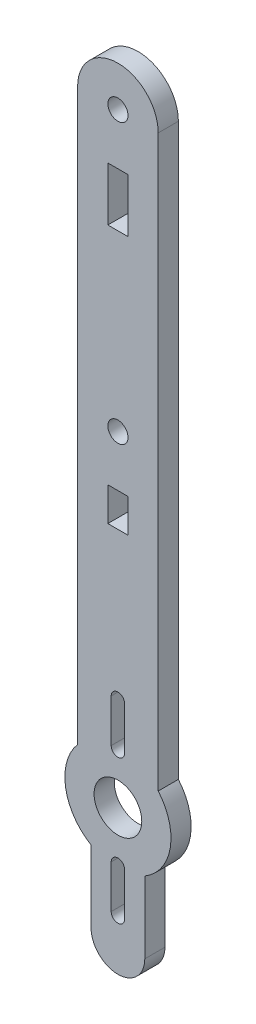
ISO-10303-21;
HEADER;
FILE_DESCRIPTION(('STEP AP214'),'2;1');
FILE_NAME('part.step','',(''),(''),'','','');
FILE_SCHEMA(('AUTOMOTIVE_DESIGN { 1 0 10303 214 1 1 1 1 }'));
ENDSEC;
DATA;
#1=APPLICATION_CONTEXT('core data for automotive mechanical design processes');
#2=APPLICATION_PROTOCOL_DEFINITION('international standard','automotive_design',2000,#1);
#3=PRODUCT_CONTEXT('',#1,'mechanical');
#4=PRODUCT('Part','Part','',(#3));
#5=PRODUCT_RELATED_PRODUCT_CATEGORY('part','',(#4));
#6=PRODUCT_DEFINITION_FORMATION('','',#4);
#7=PRODUCT_DEFINITION_CONTEXT('part definition',#1,'design');
#8=PRODUCT_DEFINITION('design','',#6,#7);
#9=PRODUCT_DEFINITION_SHAPE('','',#8);
#10=(LENGTH_UNIT() NAMED_UNIT(*) SI_UNIT(.MILLI.,.METRE.));
#11=(NAMED_UNIT(*) PLANE_ANGLE_UNIT() SI_UNIT($,.RADIAN.));
#12=(NAMED_UNIT(*) SI_UNIT($,.STERADIAN.) SOLID_ANGLE_UNIT());
#13=UNCERTAINTY_MEASURE_WITH_UNIT(LENGTH_MEASURE(1.E-05),#10,'distance_accuracy_value','');
#14=(GEOMETRIC_REPRESENTATION_CONTEXT(3) GLOBAL_UNCERTAINTY_ASSIGNED_CONTEXT((#13)) GLOBAL_UNIT_ASSIGNED_CONTEXT((#10,
#11,#12)) REPRESENTATION_CONTEXT('',''));
#15=CARTESIAN_POINT('',(0.,0.,0.));
#16=DIRECTION('',(0.,0.,1.));
#17=DIRECTION('',(1.,0.,0.));
#18=AXIS2_PLACEMENT_3D('',#15,#16,#17);
#19=CARTESIAN_POINT('',(-1.,0.,3.));
#20=DIRECTION('',(-1.,0.,0.));
#21=DIRECTION('',(0.,-1.,0.));
#22=AXIS2_PLACEMENT_3D('',#19,#20,#21);
#23=PLANE('',#22);
#24=DIRECTION('',(0.,1.,0.));
#25=VECTOR('',#24,1.);
#26=CARTESIAN_POINT('',(-1.,0.,0.));
#27=LINE('',#26,#25);
#28=CARTESIAN_POINT('',(-0.999999999999999,7.5,0.));
#29=VERTEX_POINT('',#28);
#30=CARTESIAN_POINT('',(-0.999999999999997,13.9,0.));
#31=VERTEX_POINT('',#30);
#32=EDGE_CURVE('E296',#29,#31,#27,.T.);
#33=ORIENTED_EDGE('',*,*,#32,.T.);
#34=DIRECTION('',(0.,0.,-1.));
#35=VECTOR('',#34,1.);
#36=CARTESIAN_POINT('',(-0.999999999999997,13.9,3.));
#37=LINE('',#36,#35);
#38=CARTESIAN_POINT('',(-0.999999999999997,13.9,3.));
#39=VERTEX_POINT('',#38);
#40=EDGE_CURVE('E12',#39,#31,#37,.T.);
#41=ORIENTED_EDGE('',*,*,#40,.F.);
#42=DIRECTION('',(0.,1.,0.));
#43=VECTOR('',#42,1.);
#44=CARTESIAN_POINT('',(-1.,0.,3.));
#45=LINE('',#44,#43);
#46=CARTESIAN_POINT('',(-0.999999999999999,7.5,3.));
#47=VERTEX_POINT('',#46);
#48=EDGE_CURVE('E210',#47,#39,#45,.T.);
#49=ORIENTED_EDGE('',*,*,#48,.F.);
#50=DIRECTION('',(0.,0.,-1.));
#51=VECTOR('',#50,1.);
#52=CARTESIAN_POINT('',(-0.999999999999999,7.5,3.));
#53=LINE('',#52,#51);
#54=EDGE_CURVE('E304',#47,#29,#53,.T.);
#55=ORIENTED_EDGE('',*,*,#54,.T.);
#56=EDGE_LOOP('',(#33,#41,#49,#55));
#57=FACE_BOUND('',#56,.T.);
#58=ADVANCED_FACE('F37',(#57),#23,.F.);
#59=CARTESIAN_POINT('',(0.,13.9,3.));
#60=DIRECTION('',(0.,0.,-1.));
#61=DIRECTION('',(-1.,0.,0.));
#62=AXIS2_PLACEMENT_3D('',#59,#60,#61);
#63=CYLINDRICAL_SURFACE('',#62,0.999999999999998);
#64=CARTESIAN_POINT('',(0.,13.9,0.));
#65=DIRECTION('',(0.,0.,1.));
#66=DIRECTION('',(1.,0.,0.));
#67=AXIS2_PLACEMENT_3D('',#64,#65,#66);
#68=CIRCLE('',#67,0.999999999999998);
#69=CARTESIAN_POINT('',(0.999999999999999,13.9,0.));
#70=VERTEX_POINT('',#69);
#71=EDGE_CURVE('E216',#31,#70,#68,.F.);
#72=ORIENTED_EDGE('',*,*,#71,.T.);
#73=DIRECTION('',(0.,0.,-1.));
#74=VECTOR('',#73,1.);
#75=CARTESIAN_POINT('',(0.999999999999999,13.9,3.));
#76=LINE('',#75,#74);
#77=CARTESIAN_POINT('',(0.999999999999999,13.9,3.));
#78=VERTEX_POINT('',#77);
#79=EDGE_CURVE('E47',#78,#70,#76,.T.);
#80=ORIENTED_EDGE('',*,*,#79,.F.);
#81=CARTESIAN_POINT('',(0.,13.9,3.));
#82=DIRECTION('',(0.,0.,1.));
#83=DIRECTION('',(1.,0.,0.));
#84=AXIS2_PLACEMENT_3D('',#81,#82,#83);
#85=CIRCLE('',#84,0.999999999999998);
#86=EDGE_CURVE('E204',#39,#78,#85,.F.);
#87=ORIENTED_EDGE('',*,*,#86,.F.);
#88=ORIENTED_EDGE('',*,*,#40,.T.);
#89=EDGE_LOOP('',(#72,#80,#87,#88));
#90=FACE_BOUND('',#89,.T.);
#91=ADVANCED_FACE('F215',(#90),#63,.F.);
#92=CARTESIAN_POINT('',(0.999999999999995,0.,3.));
#93=DIRECTION('',(-1.,0.,0.));
#94=DIRECTION('',(0.,-1.,0.));
#95=AXIS2_PLACEMENT_3D('',#92,#93,#94);
#96=PLANE('',#95);
#97=DIRECTION('',(0.,1.,0.));
#98=VECTOR('',#97,1.);
#99=CARTESIAN_POINT('',(0.999999999999995,0.,0.));
#100=LINE('',#99,#98);
#101=CARTESIAN_POINT('',(0.999999999999997,7.5,0.));
#102=VERTEX_POINT('',#101);
#103=EDGE_CURVE('E300',#102,#70,#100,.T.);
#104=ORIENTED_EDGE('',*,*,#103,.F.);
#105=DIRECTION('',(0.,0.,-1.));
#106=VECTOR('',#105,1.);
#107=CARTESIAN_POINT('',(0.999999999999997,7.5,3.));
#108=LINE('',#107,#106);
#109=CARTESIAN_POINT('',(0.999999999999997,7.5,3.));
#110=VERTEX_POINT('',#109);
#111=EDGE_CURVE('E132',#110,#102,#108,.T.);
#112=ORIENTED_EDGE('',*,*,#111,.F.);
#113=DIRECTION('',(0.,1.,0.));
#114=VECTOR('',#113,1.);
#115=CARTESIAN_POINT('',(0.999999999999995,0.,3.));
#116=LINE('',#115,#114);
#117=EDGE_CURVE('E208',#110,#78,#116,.T.);
#118=ORIENTED_EDGE('',*,*,#117,.T.);
#119=ORIENTED_EDGE('',*,*,#79,.T.);
#120=EDGE_LOOP('',(#104,#112,#118,#119));
#121=FACE_BOUND('',#120,.T.);
#122=ADVANCED_FACE('F221',(#121),#96,.T.);
#123=CARTESIAN_POINT('',(4.,0.,3.));
#124=DIRECTION('',(1.,0.,0.));
#125=DIRECTION('',(0.,0.,-1.));
#126=AXIS2_PLACEMENT_3D('',#123,#124,#125);
#127=PLANE('',#126);
#128=DIRECTION('',(0.,-1.,0.));
#129=VECTOR('',#128,1.);
#130=CARTESIAN_POINT('',(4.,0.,0.));
#131=LINE('',#130,#129);
#132=CARTESIAN_POINT('',(4.,-6.81248853210044,0.));
#133=VERTEX_POINT('',#132);
#134=CARTESIAN_POINT('',(4.,-17.5,0.));
#135=VERTEX_POINT('',#134);
#136=EDGE_CURVE('E272',#133,#135,#131,.T.);
#137=ORIENTED_EDGE('',*,*,#136,.F.);
#138=DIRECTION('',(0.,0.,-1.));
#139=VECTOR('',#138,1.);
#140=CARTESIAN_POINT('',(4.,-6.81248853210044,3.));
#141=LINE('',#140,#139);
#142=CARTESIAN_POINT('',(4.,-6.81248853210044,3.));
#143=VERTEX_POINT('',#142);
#144=EDGE_CURVE('E306',#143,#133,#141,.T.);
#145=ORIENTED_EDGE('',*,*,#144,.F.);
#146=DIRECTION('',(0.,-1.,0.));
#147=VECTOR('',#146,1.);
#148=CARTESIAN_POINT('',(4.,0.,3.));
#149=LINE('',#148,#147);
#150=CARTESIAN_POINT('',(4.,-17.5,3.));
#151=VERTEX_POINT('',#150);
#152=EDGE_CURVE('E404',#143,#151,#149,.T.);
#153=ORIENTED_EDGE('',*,*,#152,.T.);
#154=DIRECTION('',(0.,0.,-1.));
#155=VECTOR('',#154,1.);
#156=CARTESIAN_POINT('',(4.,-17.5,3.));
#157=LINE('',#156,#155);
#158=EDGE_CURVE('E308',#151,#135,#157,.T.);
#159=ORIENTED_EDGE('',*,*,#158,.T.);
#160=EDGE_LOOP('',(#137,#145,#153,#159));
#161=FACE_BOUND('',#160,.T.);
#162=ADVANCED_FACE('F441',(#161),#127,.T.);
#163=CARTESIAN_POINT('',(0.,0.,3.));
#164=DIRECTION('',(0.,0.,-1.));
#165=DIRECTION('',(-1.,0.,0.));
#166=AXIS2_PLACEMENT_3D('',#163,#164,#165);
#167=CYLINDRICAL_SURFACE('',#166,7.9);
#168=CARTESIAN_POINT('',(0.,0.,0.));
#169=DIRECTION('',(0.,0.,1.));
#170=DIRECTION('',(1.,0.,0.));
#171=AXIS2_PLACEMENT_3D('',#168,#169,#170);
#172=CIRCLE('',#171,7.9);
#173=CARTESIAN_POINT('',(6.,5.13906606301184,0.));
#174=VERTEX_POINT('',#173);
#175=EDGE_CURVE('E275',#133,#174,#172,.T.);
#176=ORIENTED_EDGE('',*,*,#175,.T.);
#177=DIRECTION('',(0.,0.,-1.));
#178=VECTOR('',#177,1.);
#179=CARTESIAN_POINT('',(6.,5.13906606301184,3.));
#180=LINE('',#179,#178);
#181=CARTESIAN_POINT('',(6.,5.13906606301184,3.));
#182=VERTEX_POINT('',#181);
#183=EDGE_CURVE('E322',#182,#174,#180,.T.);
#184=ORIENTED_EDGE('',*,*,#183,.F.);
#185=CARTESIAN_POINT('',(0.,0.,3.));
#186=DIRECTION('',(0.,0.,1.));
#187=DIRECTION('',(1.,0.,0.));
#188=AXIS2_PLACEMENT_3D('',#185,#186,#187);
#189=CIRCLE('',#188,7.9);
#190=EDGE_CURVE('E407',#143,#182,#189,.T.);
#191=ORIENTED_EDGE('',*,*,#190,.F.);
#192=ORIENTED_EDGE('',*,*,#144,.T.);
#193=EDGE_LOOP('',(#176,#184,#191,#192));
#194=FACE_BOUND('',#193,.T.);
#195=ADVANCED_FACE('F445',(#194),#167,.T.);
#196=CARTESIAN_POINT('',(6.,0.,3.));
#197=DIRECTION('',(1.,0.,0.));
#198=DIRECTION('',(0.,0.,-1.));
#199=AXIS2_PLACEMENT_3D('',#196,#197,#198);
#200=PLANE('',#199);
#201=DIRECTION('',(0.,-1.,0.));
#202=VECTOR('',#201,1.);
#203=CARTESIAN_POINT('',(6.,0.,0.));
#204=LINE('',#203,#202);
#205=CARTESIAN_POINT('',(6.,90.,0.));
#206=VERTEX_POINT('',#205);
#207=EDGE_CURVE('E278',#206,#174,#204,.T.);
#208=ORIENTED_EDGE('',*,*,#207,.F.);
#209=DIRECTION('',(0.,0.,-1.));
#210=VECTOR('',#209,1.);
#211=CARTESIAN_POINT('',(6.,90.,3.));
#212=LINE('',#211,#210);
#213=CARTESIAN_POINT('',(6.,90.,3.));
#214=VERTEX_POINT('',#213);
#215=EDGE_CURVE('E320',#214,#206,#212,.T.);
#216=ORIENTED_EDGE('',*,*,#215,.F.);
#217=DIRECTION('',(0.,-1.,0.));
#218=VECTOR('',#217,1.);
#219=CARTESIAN_POINT('',(6.,0.,3.));
#220=LINE('',#219,#218);
#221=EDGE_CURVE('E409',#214,#182,#220,.T.);
#222=ORIENTED_EDGE('',*,*,#221,.T.);
#223=ORIENTED_EDGE('',*,*,#183,.T.);
#224=EDGE_LOOP('',(#208,#216,#222,#223));
#225=FACE_BOUND('',#224,.T.);
#226=ADVANCED_FACE('F460',(#225),#200,.T.);
#227=CARTESIAN_POINT('',(0.,90.,3.));
#228=DIRECTION('',(0.,0.,-1.));
#229=DIRECTION('',(-1.,0.,0.));
#230=AXIS2_PLACEMENT_3D('',#227,#228,#229);
#231=CYLINDRICAL_SURFACE('',#230,6.);
#232=CARTESIAN_POINT('',(0.,90.,0.));
#233=DIRECTION('',(0.,0.,1.));
#234=DIRECTION('',(1.,0.,0.));
#235=AXIS2_PLACEMENT_3D('',#232,#233,#234);
#236=CIRCLE('',#235,6.);
#237=CARTESIAN_POINT('',(-6.,90.,0.));
#238=VERTEX_POINT('',#237);
#239=EDGE_CURVE('E281',#238,#206,#236,.F.);
#240=ORIENTED_EDGE('',*,*,#239,.F.);
#241=DIRECTION('',(0.,0.,-1.));
#242=VECTOR('',#241,1.);
#243=CARTESIAN_POINT('',(-6.,90.,3.));
#244=LINE('',#243,#242);
#245=CARTESIAN_POINT('',(-6.,90.,3.));
#246=VERTEX_POINT('',#245);
#247=EDGE_CURVE('E318',#246,#238,#244,.T.);
#248=ORIENTED_EDGE('',*,*,#247,.F.);
#249=CARTESIAN_POINT('',(0.,90.,3.));
#250=DIRECTION('',(0.,0.,1.));
#251=DIRECTION('',(1.,0.,0.));
#252=AXIS2_PLACEMENT_3D('',#249,#250,#251);
#253=CIRCLE('',#252,6.);
#254=EDGE_CURVE('E412',#246,#214,#253,.F.);
#255=ORIENTED_EDGE('',*,*,#254,.T.);
#256=ORIENTED_EDGE('',*,*,#215,.T.);
#257=EDGE_LOOP('',(#240,#248,#255,#256));
#258=FACE_BOUND('',#257,.T.);
#259=ADVANCED_FACE('F451',(#258),#231,.T.);
#260=CARTESIAN_POINT('',(-5.99999999999999,0.,3.));
#261=DIRECTION('',(1.,0.,0.));
#262=DIRECTION('',(0.,1.,0.));
#263=AXIS2_PLACEMENT_3D('',#260,#261,#262);
#264=PLANE('',#263);
#265=DIRECTION('',(0.,-1.,0.));
#266=VECTOR('',#265,1.);
#267=CARTESIAN_POINT('',(-5.99999999999999,0.,0.));
#268=LINE('',#267,#266);
#269=CARTESIAN_POINT('',(-5.99999999999999,5.13906606301186,0.));
#270=VERTEX_POINT('',#269);
#271=EDGE_CURVE('E284',#238,#270,#268,.T.);
#272=ORIENTED_EDGE('',*,*,#271,.T.);
#273=DIRECTION('',(0.,0.,-1.));
#274=VECTOR('',#273,1.);
#275=CARTESIAN_POINT('',(-5.99999999999999,5.13906606301186,3.));
#276=LINE('',#275,#274);
#277=CARTESIAN_POINT('',(-5.99999999999999,5.13906606301186,3.));
#278=VERTEX_POINT('',#277);
#279=EDGE_CURVE('E315',#278,#270,#276,.T.);
#280=ORIENTED_EDGE('',*,*,#279,.F.);
#281=DIRECTION('',(0.,-1.,0.));
#282=VECTOR('',#281,1.);
#283=CARTESIAN_POINT('',(-5.99999999999999,0.,3.));
#284=LINE('',#283,#282);
#285=EDGE_CURVE('E415',#246,#278,#284,.T.);
#286=ORIENTED_EDGE('',*,*,#285,.F.);
#287=ORIENTED_EDGE('',*,*,#247,.T.);
#288=EDGE_LOOP('',(#272,#280,#286,#287));
#289=FACE_BOUND('',#288,.T.);
#290=ADVANCED_FACE('F457',(#289),#264,.F.);
#291=CARTESIAN_POINT('',(0.,0.,3.));
#292=DIRECTION('',(0.,0.,-1.));
#293=DIRECTION('',(-1.,0.,0.));
#294=AXIS2_PLACEMENT_3D('',#291,#292,#293);
#295=CYLINDRICAL_SURFACE('',#294,7.9);
#296=CARTESIAN_POINT('',(0.,0.,0.));
#297=DIRECTION('',(0.,0.,1.));
#298=DIRECTION('',(1.,0.,0.));
#299=AXIS2_PLACEMENT_3D('',#296,#297,#298);
#300=CIRCLE('',#299,7.9);
#301=CARTESIAN_POINT('',(-4.,-6.81248853210044,0.));
#302=VERTEX_POINT('',#301);
#303=EDGE_CURVE('E287',#270,#302,#300,.T.);
#304=ORIENTED_EDGE('',*,*,#303,.T.);
#305=DIRECTION('',(0.,0.,-1.));
#306=VECTOR('',#305,1.);
#307=CARTESIAN_POINT('',(-4.,-6.81248853210044,3.));
#308=LINE('',#307,#306);
#309=CARTESIAN_POINT('',(-4.,-6.81248853210044,3.));
#310=VERTEX_POINT('',#309);
#311=EDGE_CURVE('E313',#310,#302,#308,.T.);
#312=ORIENTED_EDGE('',*,*,#311,.F.);
#313=CARTESIAN_POINT('',(0.,0.,3.));
#314=DIRECTION('',(0.,0.,1.));
#315=DIRECTION('',(1.,0.,0.));
#316=AXIS2_PLACEMENT_3D('',#313,#314,#315);
#317=CIRCLE('',#316,7.9);
#318=EDGE_CURVE('E418',#278,#310,#317,.T.);
#319=ORIENTED_EDGE('',*,*,#318,.F.);
#320=ORIENTED_EDGE('',*,*,#279,.T.);
#321=EDGE_LOOP('',(#304,#312,#319,#320));
#322=FACE_BOUND('',#321,.T.);
#323=ADVANCED_FACE('F459',(#322),#295,.T.);
#324=CARTESIAN_POINT('',(-4.,0.,3.));
#325=DIRECTION('',(-1.,0.,0.));
#326=DIRECTION('',(0.,0.,1.));
#327=AXIS2_PLACEMENT_3D('',#324,#325,#326);
#328=PLANE('',#327);
#329=DIRECTION('',(0.,1.,0.));
#330=VECTOR('',#329,1.);
#331=CARTESIAN_POINT('',(-4.,0.,0.));
#332=LINE('',#331,#330);
#333=CARTESIAN_POINT('',(-4.,-17.5,0.));
#334=VERTEX_POINT('',#333);
#335=EDGE_CURVE('E290',#334,#302,#332,.T.);
#336=ORIENTED_EDGE('',*,*,#335,.F.);
#337=DIRECTION('',(0.,0.,-1.));
#338=VECTOR('',#337,1.);
#339=CARTESIAN_POINT('',(-4.,-17.5,3.));
#340=LINE('',#339,#338);
#341=CARTESIAN_POINT('',(-4.,-17.5,3.));
#342=VERTEX_POINT('',#341);
#343=EDGE_CURVE('E310',#342,#334,#340,.T.);
#344=ORIENTED_EDGE('',*,*,#343,.F.);
#345=DIRECTION('',(0.,1.,0.));
#346=VECTOR('',#345,1.);
#347=CARTESIAN_POINT('',(-4.,0.,3.));
#348=LINE('',#347,#346);
#349=EDGE_CURVE('E420',#342,#310,#348,.T.);
#350=ORIENTED_EDGE('',*,*,#349,.T.);
#351=ORIENTED_EDGE('',*,*,#311,.T.);
#352=EDGE_LOOP('',(#336,#344,#350,#351));
#353=FACE_BOUND('',#352,.T.);
#354=ADVANCED_FACE('F435',(#353),#328,.T.);
#355=CARTESIAN_POINT('',(0.,82.3769852360415,3.));
#356=DIRECTION('',(0.,-1.,0.));
#357=DIRECTION('',(0.,0.,-1.));
#358=AXIS2_PLACEMENT_3D('',#355,#356,#357);
#359=PLANE('',#358);
#360=DIRECTION('',(-1.,0.,0.));
#361=VECTOR('',#360,1.);
#362=CARTESIAN_POINT('',(0.,82.3769852360415,0.));
#363=LINE('',#362,#361);
#364=CARTESIAN_POINT('',(1.49999999999997,82.3769852360415,0.));
#365=VERTEX_POINT('',#364);
#366=CARTESIAN_POINT('',(-1.50000000000003,82.3769852360415,0.));
#367=VERTEX_POINT('',#366);
#368=EDGE_CURVE('E254',#365,#367,#363,.T.);
#369=ORIENTED_EDGE('',*,*,#368,.F.);
#370=DIRECTION('',(0.,0.,-1.));
#371=VECTOR('',#370,1.);
#372=CARTESIAN_POINT('',(1.49999999999997,82.3769852360415,3.));
#373=LINE('',#372,#371);
#374=CARTESIAN_POINT('',(1.49999999999997,82.3769852360415,3.));
#375=VERTEX_POINT('',#374);
#376=EDGE_CURVE('E311',#375,#365,#373,.T.);
#377=ORIENTED_EDGE('',*,*,#376,.F.);
#378=DIRECTION('',(-1.,0.,0.));
#379=VECTOR('',#378,1.);
#380=CARTESIAN_POINT('',(0.,82.3769852360415,3.));
#381=LINE('',#380,#379);
#382=CARTESIAN_POINT('',(-1.50000000000003,82.3769852360415,3.));
#383=VERTEX_POINT('',#382);
#384=EDGE_CURVE('E385',#375,#383,#381,.T.);
#385=ORIENTED_EDGE('',*,*,#384,.T.);
#386=DIRECTION('',(0.,0.,-1.));
#387=VECTOR('',#386,1.);
#388=CARTESIAN_POINT('',(-1.50000000000003,82.3769852360415,3.));
#389=LINE('',#388,#387);
#390=EDGE_CURVE('E325',#383,#367,#389,.T.);
#391=ORIENTED_EDGE('',*,*,#390,.T.);
#392=EDGE_LOOP('',(#369,#377,#385,#391));
#393=FACE_BOUND('',#392,.T.);
#394=ADVANCED_FACE('F483',(#393),#359,.T.);
#395=CARTESIAN_POINT('',(1.50000000000002,0.,3.));
#396=DIRECTION('',(-1.,0.,0.));
#397=DIRECTION('',(0.,-1.,0.));
#398=AXIS2_PLACEMENT_3D('',#395,#396,#397);
#399=PLANE('',#398);
#400=DIRECTION('',(0.,1.,0.));
#401=VECTOR('',#400,1.);
#402=CARTESIAN_POINT('',(1.50000000000002,0.,0.));
#403=LINE('',#402,#401);
#404=CARTESIAN_POINT('',(1.49999999999997,74.3769852360415,0.));
#405=VERTEX_POINT('',#404);
#406=EDGE_CURVE('E257',#405,#365,#403,.T.);
#407=ORIENTED_EDGE('',*,*,#406,.F.);
#408=DIRECTION('',(0.,0.,-1.));
#409=VECTOR('',#408,1.);
#410=CARTESIAN_POINT('',(1.49999999999997,74.3769852360415,3.));
#411=LINE('',#410,#409);
#412=CARTESIAN_POINT('',(1.49999999999997,74.3769852360415,3.));
#413=VERTEX_POINT('',#412);
#414=EDGE_CURVE('E331',#413,#405,#411,.T.);
#415=ORIENTED_EDGE('',*,*,#414,.F.);
#416=DIRECTION('',(0.,1.,0.));
#417=VECTOR('',#416,1.);
#418=CARTESIAN_POINT('',(1.50000000000002,0.,3.));
#419=LINE('',#418,#417);
#420=EDGE_CURVE('E389',#413,#375,#419,.T.);
#421=ORIENTED_EDGE('',*,*,#420,.T.);
#422=ORIENTED_EDGE('',*,*,#376,.T.);
#423=EDGE_LOOP('',(#407,#415,#421,#422));
#424=FACE_BOUND('',#423,.T.);
#425=ADVANCED_FACE('F505',(#424),#399,.T.);
#426=CARTESIAN_POINT('',(0.,74.3769852360415,3.));
#427=DIRECTION('',(0.,1.,0.));
#428=DIRECTION('',(0.,0.,1.));
#429=AXIS2_PLACEMENT_3D('',#426,#427,#428);
#430=PLANE('',#429);
#431=DIRECTION('',(1.,0.,0.));
#432=VECTOR('',#431,1.);
#433=CARTESIAN_POINT('',(0.,74.3769852360415,0.));
#434=LINE('',#433,#432);
#435=CARTESIAN_POINT('',(-1.50000000000003,74.3769852360415,0.));
#436=VERTEX_POINT('',#435);
#437=EDGE_CURVE('E260',#436,#405,#434,.T.);
#438=ORIENTED_EDGE('',*,*,#437,.F.);
#439=DIRECTION('',(0.,0.,-1.));
#440=VECTOR('',#439,1.);
#441=CARTESIAN_POINT('',(-1.50000000000003,74.3769852360415,3.));
#442=LINE('',#441,#440);
#443=CARTESIAN_POINT('',(-1.50000000000003,74.3769852360415,3.));
#444=VERTEX_POINT('',#443);
#445=EDGE_CURVE('E328',#444,#436,#442,.T.);
#446=ORIENTED_EDGE('',*,*,#445,.F.);
#447=DIRECTION('',(1.,0.,0.));
#448=VECTOR('',#447,1.);
#449=CARTESIAN_POINT('',(0.,74.3769852360415,3.));
#450=LINE('',#449,#448);
#451=EDGE_CURVE('E392',#444,#413,#450,.T.);
#452=ORIENTED_EDGE('',*,*,#451,.T.);
#453=ORIENTED_EDGE('',*,*,#414,.T.);
#454=EDGE_LOOP('',(#438,#446,#452,#453));
#455=FACE_BOUND('',#454,.T.);
#456=ADVANCED_FACE('F513',(#455),#430,.T.);
#457=CARTESIAN_POINT('',(0.,40.8769852360415,3.));
#458=DIRECTION('',(0.,-1.,0.));
#459=DIRECTION('',(0.,0.,-1.));
#460=AXIS2_PLACEMENT_3D('',#457,#458,#459);
#461=PLANE('',#460);
#462=DIRECTION('',(-1.,0.,0.));
#463=VECTOR('',#462,1.);
#464=CARTESIAN_POINT('',(0.,40.8769852360415,0.));
#465=LINE('',#464,#463);
#466=CARTESIAN_POINT('',(1.49999999999999,40.8769852360415,0.));
#467=VERTEX_POINT('',#466);
#468=CARTESIAN_POINT('',(-1.50000000000001,40.8769852360415,0.));
#469=VERTEX_POINT('',#468);
#470=EDGE_CURVE('E242',#467,#469,#465,.T.);
#471=ORIENTED_EDGE('',*,*,#470,.F.);
#472=DIRECTION('',(0.,0.,-1.));
#473=VECTOR('',#472,1.);
#474=CARTESIAN_POINT('',(1.49999999999999,40.8769852360415,3.));
#475=LINE('',#474,#473);
#476=CARTESIAN_POINT('',(1.49999999999999,40.8769852360415,3.));
#477=VERTEX_POINT('',#476);
#478=EDGE_CURVE('E329',#477,#467,#475,.T.);
#479=ORIENTED_EDGE('',*,*,#478,.F.);
#480=DIRECTION('',(-1.,0.,0.));
#481=VECTOR('',#480,1.);
#482=CARTESIAN_POINT('',(0.,40.8769852360415,3.));
#483=LINE('',#482,#481);
#484=CARTESIAN_POINT('',(-1.50000000000001,40.8769852360415,3.));
#485=VERTEX_POINT('',#484);
#486=EDGE_CURVE('E367',#477,#485,#483,.T.);
#487=ORIENTED_EDGE('',*,*,#486,.T.);
#488=DIRECTION('',(0.,0.,-1.));
#489=VECTOR('',#488,1.);
#490=CARTESIAN_POINT('',(-1.50000000000001,40.8769852360415,3.));
#491=LINE('',#490,#489);
#492=EDGE_CURVE('E334',#485,#469,#491,.T.);
#493=ORIENTED_EDGE('',*,*,#492,.T.);
#494=EDGE_LOOP('',(#471,#479,#487,#493));
#495=FACE_BOUND('',#494,.T.);
#496=ADVANCED_FACE('F521',(#495),#461,.T.);
#497=CARTESIAN_POINT('',(1.50000000000002,0.,3.));
#498=DIRECTION('',(-1.,0.,0.));
#499=DIRECTION('',(0.,-1.,0.));
#500=AXIS2_PLACEMENT_3D('',#497,#498,#499);
#501=PLANE('',#500);
#502=DIRECTION('',(0.,1.,0.));
#503=VECTOR('',#502,1.);
#504=CARTESIAN_POINT('',(1.50000000000002,0.,0.));
#505=LINE('',#504,#503);
#506=CARTESIAN_POINT('',(1.5,35.8769852360415,0.));
#507=VERTEX_POINT('',#506);
#508=EDGE_CURVE('E245',#507,#467,#505,.T.);
#509=ORIENTED_EDGE('',*,*,#508,.F.);
#510=DIRECTION('',(0.,0.,-1.));
#511=VECTOR('',#510,1.);
#512=CARTESIAN_POINT('',(1.5,35.8769852360415,3.));
#513=LINE('',#512,#511);
#514=CARTESIAN_POINT('',(1.5,35.8769852360415,3.));
#515=VERTEX_POINT('',#514);
#516=EDGE_CURVE('E338',#515,#507,#513,.T.);
#517=ORIENTED_EDGE('',*,*,#516,.F.);
#518=DIRECTION('',(0.,1.,0.));
#519=VECTOR('',#518,1.);
#520=CARTESIAN_POINT('',(1.50000000000002,0.,3.));
#521=LINE('',#520,#519);
#522=EDGE_CURVE('E377',#515,#477,#521,.T.);
#523=ORIENTED_EDGE('',*,*,#522,.T.);
#524=ORIENTED_EDGE('',*,*,#478,.T.);
#525=EDGE_LOOP('',(#509,#517,#523,#524));
#526=FACE_BOUND('',#525,.T.);
#527=ADVANCED_FACE('F529',(#526),#501,.T.);
#528=CARTESIAN_POINT('',(0.,35.8769852360415,3.));
#529=DIRECTION('',(0.,1.,0.));
#530=DIRECTION('',(0.,0.,1.));
#531=AXIS2_PLACEMENT_3D('',#528,#529,#530);
#532=PLANE('',#531);
#533=DIRECTION('',(1.,0.,0.));
#534=VECTOR('',#533,1.);
#535=CARTESIAN_POINT('',(0.,35.8769852360415,0.));
#536=LINE('',#535,#534);
#537=CARTESIAN_POINT('',(-1.5,35.8769852360415,0.));
#538=VERTEX_POINT('',#537);
#539=EDGE_CURVE('E248',#538,#507,#536,.T.);
#540=ORIENTED_EDGE('',*,*,#539,.F.);
#541=DIRECTION('',(0.,0.,-1.));
#542=VECTOR('',#541,1.);
#543=CARTESIAN_POINT('',(-1.5,35.8769852360415,3.));
#544=LINE('',#543,#542);
#545=CARTESIAN_POINT('',(-1.5,35.8769852360415,3.));
#546=VERTEX_POINT('',#545);
#547=EDGE_CURVE('E336',#546,#538,#544,.T.);
#548=ORIENTED_EDGE('',*,*,#547,.F.);
#549=DIRECTION('',(1.,0.,0.));
#550=VECTOR('',#549,1.);
#551=CARTESIAN_POINT('',(0.,35.8769852360415,3.));
#552=LINE('',#551,#550);
#553=EDGE_CURVE('E380',#546,#515,#552,.T.);
#554=ORIENTED_EDGE('',*,*,#553,.T.);
#555=ORIENTED_EDGE('',*,*,#516,.T.);
#556=EDGE_LOOP('',(#540,#548,#554,#555));
#557=FACE_BOUND('',#556,.T.);
#558=ADVANCED_FACE('F537',(#557),#532,.T.);
#559=CARTESIAN_POINT('',(0.,-13.9,3.));
#560=DIRECTION('',(0.,0.,-1.));
#561=DIRECTION('',(-1.,0.,0.));
#562=AXIS2_PLACEMENT_3D('',#559,#560,#561);
#563=CYLINDRICAL_SURFACE('',#562,0.999999999999998);
#564=CARTESIAN_POINT('',(0.,-13.9,0.));
#565=DIRECTION('',(0.,0.,1.));
#566=DIRECTION('',(1.,0.,0.));
#567=AXIS2_PLACEMENT_3D('',#564,#565,#566);
#568=CIRCLE('',#567,0.999999999999998);
#569=CARTESIAN_POINT('',(-0.999999999999997,-13.9,0.));
#570=VERTEX_POINT('',#569);
#571=CARTESIAN_POINT('',(0.999999999999999,-13.9,0.));
#572=VERTEX_POINT('',#571);
#573=EDGE_CURVE('E230',#570,#572,#568,.T.);
#574=ORIENTED_EDGE('',*,*,#573,.F.);
#575=DIRECTION('',(0.,0.,-1.));
#576=VECTOR('',#575,1.);
#577=CARTESIAN_POINT('',(-0.999999999999997,-13.9,3.));
#578=LINE('',#577,#576);
#579=CARTESIAN_POINT('',(-0.999999999999997,-13.9,3.));
#580=VERTEX_POINT('',#579);
#581=EDGE_CURVE('E41',#580,#570,#578,.T.);
#582=ORIENTED_EDGE('',*,*,#581,.F.);
#583=CARTESIAN_POINT('',(0.,-13.9,3.));
#584=DIRECTION('',(0.,0.,1.));
#585=DIRECTION('',(1.,0.,0.));
#586=AXIS2_PLACEMENT_3D('',#583,#584,#585);
#587=CIRCLE('',#586,0.999999999999998);
#588=CARTESIAN_POINT('',(0.999999999999999,-13.9,3.));
#589=VERTEX_POINT('',#588);
#590=EDGE_CURVE('E371',#580,#589,#587,.T.);
#591=ORIENTED_EDGE('',*,*,#590,.T.);
#592=DIRECTION('',(0.,0.,-1.));
#593=VECTOR('',#592,1.);
#594=CARTESIAN_POINT('',(0.999999999999999,-13.9,3.));
#595=LINE('',#594,#593);
#596=EDGE_CURVE('E223',#589,#572,#595,.T.);
#597=ORIENTED_EDGE('',*,*,#596,.T.);
#598=EDGE_LOOP('',(#574,#582,#591,#597));
#599=FACE_BOUND('',#598,.T.);
#600=ADVANCED_FACE('F353',(#599),#563,.F.);
#601=CARTESIAN_POINT('',(-1.,0.,3.));
#602=DIRECTION('',(1.,0.,0.));
#603=DIRECTION('',(0.,1.,0.));
#604=AXIS2_PLACEMENT_3D('',#601,#602,#603);
#605=PLANE('',#604);
#606=DIRECTION('',(0.,-1.,0.));
#607=VECTOR('',#606,1.);
#608=CARTESIAN_POINT('',(-1.,0.,0.));
#609=LINE('',#608,#607);
#610=CARTESIAN_POINT('',(-0.999999999999999,-7.5,0.));
#611=VERTEX_POINT('',#610);
#612=EDGE_CURVE('E233',#611,#570,#609,.T.);
#613=ORIENTED_EDGE('',*,*,#612,.F.);
#614=DIRECTION('',(0.,0.,-1.));
#615=VECTOR('',#614,1.);
#616=CARTESIAN_POINT('',(-0.999999999999999,-7.5,3.));
#617=LINE('',#616,#615);
#618=CARTESIAN_POINT('',(-0.999999999999999,-7.5,3.));
#619=VERTEX_POINT('',#618);
#620=EDGE_CURVE('E343',#619,#611,#617,.T.);
#621=ORIENTED_EDGE('',*,*,#620,.F.);
#622=DIRECTION('',(0.,-1.,0.));
#623=VECTOR('',#622,1.);
#624=CARTESIAN_POINT('',(-1.,0.,3.));
#625=LINE('',#624,#623);
#626=EDGE_CURVE('E352',#619,#580,#625,.T.);
#627=ORIENTED_EDGE('',*,*,#626,.T.);
#628=ORIENTED_EDGE('',*,*,#581,.T.);
#629=EDGE_LOOP('',(#613,#621,#627,#628));
#630=FACE_BOUND('',#629,.T.);
#631=ADVANCED_FACE('F350',(#630),#605,.T.);
#632=CARTESIAN_POINT('',(0.,-7.5,3.));
#633=DIRECTION('',(0.,0.,-1.));
#634=DIRECTION('',(-1.,0.,0.));
#635=AXIS2_PLACEMENT_3D('',#632,#633,#634);
#636=CYLINDRICAL_SURFACE('',#635,0.999999999999998);
#637=CARTESIAN_POINT('',(0.,-7.5,0.));
#638=DIRECTION('',(0.,0.,1.));
#639=DIRECTION('',(1.,0.,0.));
#640=AXIS2_PLACEMENT_3D('',#637,#638,#639);
#641=CIRCLE('',#640,0.999999999999998);
#642=CARTESIAN_POINT('',(0.999999999999997,-7.5,0.));
#643=VERTEX_POINT('',#642);
#644=EDGE_CURVE('E236',#643,#611,#641,.T.);
#645=ORIENTED_EDGE('',*,*,#644,.F.);
#646=DIRECTION('',(0.,0.,-1.));
#647=VECTOR('',#646,1.);
#648=CARTESIAN_POINT('',(0.999999999999997,-7.5,3.));
#649=LINE('',#648,#647);
#650=CARTESIAN_POINT('',(0.999999999999997,-7.5,3.));
#651=VERTEX_POINT('',#650);
#652=EDGE_CURVE('E342',#651,#643,#649,.T.);
#653=ORIENTED_EDGE('',*,*,#652,.F.);
#654=CARTESIAN_POINT('',(0.,-7.5,3.));
#655=DIRECTION('',(0.,0.,1.));
#656=DIRECTION('',(1.,0.,0.));
#657=AXIS2_PLACEMENT_3D('',#654,#655,#656);
#658=CIRCLE('',#657,0.999999999999998);
#659=EDGE_CURVE('E362',#651,#619,#658,.T.);
#660=ORIENTED_EDGE('',*,*,#659,.T.);
#661=ORIENTED_EDGE('',*,*,#620,.T.);
#662=EDGE_LOOP('',(#645,#653,#660,#661));
#663=FACE_BOUND('',#662,.T.);
#664=ADVANCED_FACE('F359',(#663),#636,.F.);
#665=CARTESIAN_POINT('',(0.,-17.5,3.));
#666=DIRECTION('',(0.,0.,-1.));
#667=DIRECTION('',(-1.,0.,0.));
#668=AXIS2_PLACEMENT_3D('',#665,#666,#667);
#669=CYLINDRICAL_SURFACE('',#668,4.);
#670=CARTESIAN_POINT('',(0.,-17.5,0.));
#671=DIRECTION('',(0.,0.,1.));
#672=DIRECTION('',(1.,0.,0.));
#673=AXIS2_PLACEMENT_3D('',#670,#671,#672);
#674=CIRCLE('',#673,4.);
#675=EDGE_CURVE('E293',#135,#334,#674,.F.);
#676=ORIENTED_EDGE('',*,*,#675,.F.);
#677=ORIENTED_EDGE('',*,*,#158,.F.);
#678=CARTESIAN_POINT('',(0.,-17.5,3.));
#679=DIRECTION('',(0.,0.,1.));
#680=DIRECTION('',(1.,0.,0.));
#681=AXIS2_PLACEMENT_3D('',#678,#679,#680);
#682=CIRCLE('',#681,4.);
#683=EDGE_CURVE('E423',#151,#342,#682,.F.);
#684=ORIENTED_EDGE('',*,*,#683,.T.);
#685=ORIENTED_EDGE('',*,*,#343,.T.);
#686=EDGE_LOOP('',(#676,#677,#684,#685));
#687=FACE_BOUND('',#686,.T.);
#688=ADVANCED_FACE('F428',(#687),#669,.T.);
#689=CARTESIAN_POINT('',(0.,90.,3.));
#690=DIRECTION('',(0.,0.,-1.));
#691=DIRECTION('',(-1.,0.,0.));
#692=AXIS2_PLACEMENT_3D('',#689,#690,#691);
#693=CYLINDRICAL_SURFACE('',#692,1.5);
#694=CARTESIAN_POINT('',(0.,90.,3.));
#695=DIRECTION('',(0.,0.,1.));
#696=DIRECTION('',(1.,0.,0.));
#697=AXIS2_PLACEMENT_3D('',#694,#695,#696);
#698=CIRCLE('',#697,1.5);
#699=CARTESIAN_POINT('',(1.5,90.,3.));
#700=VERTEX_POINT('',#699);
#701=EDGE_CURVE('E401',#700,#700,#698,.T.);
#702=ORIENTED_EDGE('',*,*,#701,.T.);
#703=EDGE_LOOP('',(#702));
#704=FACE_BOUND('',#703,.T.);
#705=CARTESIAN_POINT('',(0.,90.,0.));
#706=DIRECTION('',(0.,0.,1.));
#707=DIRECTION('',(1.,0.,0.));
#708=AXIS2_PLACEMENT_3D('',#705,#706,#707);
#709=CIRCLE('',#708,1.5);
#710=CARTESIAN_POINT('',(1.5,90.,0.));
#711=VERTEX_POINT('',#710);
#712=EDGE_CURVE('E269',#711,#711,#709,.T.);
#713=ORIENTED_EDGE('',*,*,#712,.F.);
#714=EDGE_LOOP('',(#713));
#715=FACE_BOUND('',#714,.T.);
#716=ADVANCED_FACE('F480',(#704,#715),#693,.F.);
#717=CARTESIAN_POINT('',(0.,0.,3.));
#718=DIRECTION('',(0.,0.,-1.));
#719=DIRECTION('',(-1.,0.,0.));
#720=AXIS2_PLACEMENT_3D('',#717,#718,#719);
#721=CYLINDRICAL_SURFACE('',#720,3.55);
#722=CARTESIAN_POINT('',(0.,0.,3.));
#723=DIRECTION('',(0.,0.,1.));
#724=DIRECTION('',(1.,0.,0.));
#725=AXIS2_PLACEMENT_3D('',#722,#723,#724);
#726=CIRCLE('',#725,3.55);
#727=CARTESIAN_POINT('',(3.55,0.,3.));
#728=VERTEX_POINT('',#727);
#729=EDGE_CURVE('E398',#728,#728,#726,.T.);
#730=ORIENTED_EDGE('',*,*,#729,.T.);
#731=EDGE_LOOP('',(#730));
#732=FACE_BOUND('',#731,.T.);
#733=CARTESIAN_POINT('',(0.,0.,0.));
#734=DIRECTION('',(0.,0.,1.));
#735=DIRECTION('',(1.,0.,0.));
#736=AXIS2_PLACEMENT_3D('',#733,#734,#735);
#737=CIRCLE('',#736,3.55);
#738=CARTESIAN_POINT('',(3.55,0.,0.));
#739=VERTEX_POINT('',#738);
#740=EDGE_CURVE('E266',#739,#739,#737,.T.);
#741=ORIENTED_EDGE('',*,*,#740,.F.);
#742=EDGE_LOOP('',(#741));
#743=FACE_BOUND('',#742,.T.);
#744=ADVANCED_FACE('F573',(#732,#743),#721,.F.);
#745=CARTESIAN_POINT('',(-1.49999999999998,0.,3.));
#746=DIRECTION('',(1.,0.,0.));
#747=DIRECTION('',(0.,1.,0.));
#748=AXIS2_PLACEMENT_3D('',#745,#746,#747);
#749=PLANE('',#748);
#750=DIRECTION('',(0.,-1.,0.));
#751=VECTOR('',#750,1.);
#752=CARTESIAN_POINT('',(-1.49999999999998,0.,0.));
#753=LINE('',#752,#751);
#754=EDGE_CURVE('E263',#367,#436,#753,.T.);
#755=ORIENTED_EDGE('',*,*,#754,.F.);
#756=ORIENTED_EDGE('',*,*,#390,.F.);
#757=DIRECTION('',(0.,-1.,0.));
#758=VECTOR('',#757,1.);
#759=CARTESIAN_POINT('',(-1.49999999999998,0.,3.));
#760=LINE('',#759,#758);
#761=EDGE_CURVE('E395',#383,#444,#760,.T.);
#762=ORIENTED_EDGE('',*,*,#761,.T.);
#763=ORIENTED_EDGE('',*,*,#445,.T.);
#764=EDGE_LOOP('',(#755,#756,#762,#763));
#765=FACE_BOUND('',#764,.T.);
#766=ADVANCED_FACE('F581',(#765),#749,.T.);
#767=CARTESIAN_POINT('',(-1.49999999999998,0.,3.));
#768=DIRECTION('',(1.,0.,0.));
#769=DIRECTION('',(0.,1.,0.));
#770=AXIS2_PLACEMENT_3D('',#767,#768,#769);
#771=PLANE('',#770);
#772=DIRECTION('',(0.,-1.,0.));
#773=VECTOR('',#772,1.);
#774=CARTESIAN_POINT('',(-1.49999999999998,0.,0.));
#775=LINE('',#774,#773);
#776=EDGE_CURVE('E251',#469,#538,#775,.T.);
#777=ORIENTED_EDGE('',*,*,#776,.F.);
#778=ORIENTED_EDGE('',*,*,#492,.F.);
#779=DIRECTION('',(0.,-1.,0.));
#780=VECTOR('',#779,1.);
#781=CARTESIAN_POINT('',(-1.49999999999998,0.,3.));
#782=LINE('',#781,#780);
#783=EDGE_CURVE('E383',#485,#546,#782,.T.);
#784=ORIENTED_EDGE('',*,*,#783,.T.);
#785=ORIENTED_EDGE('',*,*,#547,.T.);
#786=EDGE_LOOP('',(#777,#778,#784,#785));
#787=FACE_BOUND('',#786,.T.);
#788=ADVANCED_FACE('F589',(#787),#771,.T.);
#789=CARTESIAN_POINT('',(0.999999999999995,0.,3.));
#790=DIRECTION('',(1.,0.,0.));
#791=DIRECTION('',(0.,1.,0.));
#792=AXIS2_PLACEMENT_3D('',#789,#790,#791);
#793=PLANE('',#792);
#794=DIRECTION('',(0.,-1.,0.));
#795=VECTOR('',#794,1.);
#796=CARTESIAN_POINT('',(0.999999999999995,0.,0.));
#797=LINE('',#796,#795);
#798=EDGE_CURVE('E239',#643,#572,#797,.T.);
#799=ORIENTED_EDGE('',*,*,#798,.T.);
#800=ORIENTED_EDGE('',*,*,#596,.F.);
#801=DIRECTION('',(0.,-1.,0.));
#802=VECTOR('',#801,1.);
#803=CARTESIAN_POINT('',(0.999999999999995,0.,3.));
#804=LINE('',#803,#802);
#805=EDGE_CURVE('E364',#651,#589,#804,.T.);
#806=ORIENTED_EDGE('',*,*,#805,.F.);
#807=ORIENTED_EDGE('',*,*,#652,.T.);
#808=EDGE_LOOP('',(#799,#800,#806,#807));
#809=FACE_BOUND('',#808,.T.);
#810=ADVANCED_FACE('F365',(#809),#793,.F.);
#811=CARTESIAN_POINT('',(0.,48.4769852360415,3.));
#812=DIRECTION('',(0.,0.,-1.));
#813=DIRECTION('',(-1.,0.,0.));
#814=AXIS2_PLACEMENT_3D('',#811,#812,#813);
#815=CYLINDRICAL_SURFACE('',#814,1.5);
#816=CARTESIAN_POINT('',(0.,48.4769852360415,3.));
#817=DIRECTION('',(0.,0.,1.));
#818=DIRECTION('',(1.,0.,0.));
#819=AXIS2_PLACEMENT_3D('',#816,#817,#818);
#820=CIRCLE('',#819,1.5);
#821=CARTESIAN_POINT('',(1.49999999999997,48.4769852360415,3.));
#822=VERTEX_POINT('',#821);
#823=EDGE_CURVE('E303',#822,#822,#820,.T.);
#824=ORIENTED_EDGE('',*,*,#823,.T.);
#825=EDGE_LOOP('',(#824));
#826=FACE_BOUND('',#825,.T.);
#827=CARTESIAN_POINT('',(0.,48.4769852360415,0.));
#828=DIRECTION('',(0.,0.,1.));
#829=DIRECTION('',(1.,0.,0.));
#830=AXIS2_PLACEMENT_3D('',#827,#828,#829);
#831=CIRCLE('',#830,1.5);
#832=CARTESIAN_POINT('',(1.49999999999997,48.4769852360415,0.));
#833=VERTEX_POINT('',#832);
#834=EDGE_CURVE('E227',#833,#833,#831,.T.);
#835=ORIENTED_EDGE('',*,*,#834,.F.);
#836=EDGE_LOOP('',(#835));
#837=FACE_BOUND('',#836,.T.);
#838=ADVANCED_FACE('F39',(#826,#837),#815,.F.);
#839=CARTESIAN_POINT('',(0.,7.5,3.));
#840=DIRECTION('',(0.,0.,-1.));
#841=DIRECTION('',(-1.,0.,0.));
#842=AXIS2_PLACEMENT_3D('',#839,#840,#841);
#843=CYLINDRICAL_SURFACE('',#842,0.999999999999998);
#844=CARTESIAN_POINT('',(0.,7.5,0.));
#845=DIRECTION('',(0.,0.,1.));
#846=DIRECTION('',(1.,0.,0.));
#847=AXIS2_PLACEMENT_3D('',#844,#845,#846);
#848=CIRCLE('',#847,0.999999999999998);
#849=EDGE_CURVE('E135',#102,#29,#848,.F.);
#850=ORIENTED_EDGE('',*,*,#849,.T.);
#851=ORIENTED_EDGE('',*,*,#54,.F.);
#852=CARTESIAN_POINT('',(0.,7.5,3.));
#853=DIRECTION('',(0.,0.,1.));
#854=DIRECTION('',(1.,0.,0.));
#855=AXIS2_PLACEMENT_3D('',#852,#853,#854);
#856=CIRCLE('',#855,0.999999999999998);
#857=EDGE_CURVE('E56',#110,#47,#856,.F.);
#858=ORIENTED_EDGE('',*,*,#857,.F.);
#859=ORIENTED_EDGE('',*,*,#111,.T.);
#860=EDGE_LOOP('',(#850,#851,#858,#859));
#861=FACE_BOUND('',#860,.T.);
#862=ADVANCED_FACE('F610',(#861),#843,.F.);
#863=CARTESIAN_POINT('',(0.,0.,3.));
#864=DIRECTION('',(0.,0.,1.));
#865=DIRECTION('',(1.,0.,0.));
#866=AXIS2_PLACEMENT_3D('',#863,#864,#865);
#867=PLANE('',#866);
#868=ORIENTED_EDGE('',*,*,#823,.F.);
#869=EDGE_LOOP('',(#868));
#870=FACE_BOUND('',#869,.T.);
#871=ORIENTED_EDGE('',*,*,#590,.F.);
#872=ORIENTED_EDGE('',*,*,#626,.F.);
#873=ORIENTED_EDGE('',*,*,#659,.F.);
#874=ORIENTED_EDGE('',*,*,#805,.T.);
#875=EDGE_LOOP('',(#871,#872,#873,#874));
#876=FACE_BOUND('',#875,.T.);
#877=ORIENTED_EDGE('',*,*,#486,.F.);
#878=ORIENTED_EDGE('',*,*,#522,.F.);
#879=ORIENTED_EDGE('',*,*,#553,.F.);
#880=ORIENTED_EDGE('',*,*,#783,.F.);
#881=EDGE_LOOP('',(#877,#878,#879,#880));
#882=FACE_BOUND('',#881,.T.);
#883=ORIENTED_EDGE('',*,*,#384,.F.);
#884=ORIENTED_EDGE('',*,*,#420,.F.);
#885=ORIENTED_EDGE('',*,*,#451,.F.);
#886=ORIENTED_EDGE('',*,*,#761,.F.);
#887=EDGE_LOOP('',(#883,#884,#885,#886));
#888=FACE_BOUND('',#887,.T.);
#889=ORIENTED_EDGE('',*,*,#729,.F.);
#890=EDGE_LOOP('',(#889));
#891=FACE_BOUND('',#890,.T.);
#892=ORIENTED_EDGE('',*,*,#701,.F.);
#893=EDGE_LOOP('',(#892));
#894=FACE_BOUND('',#893,.T.);
#895=ORIENTED_EDGE('',*,*,#152,.F.);
#896=ORIENTED_EDGE('',*,*,#190,.T.);
#897=ORIENTED_EDGE('',*,*,#221,.F.);
#898=ORIENTED_EDGE('',*,*,#254,.F.);
#899=ORIENTED_EDGE('',*,*,#285,.T.);
#900=ORIENTED_EDGE('',*,*,#318,.T.);
#901=ORIENTED_EDGE('',*,*,#349,.F.);
#902=ORIENTED_EDGE('',*,*,#683,.F.);
#903=EDGE_LOOP('',(#895,#896,#897,#898,#899,#900,#901,#902));
#904=FACE_BOUND('',#903,.T.);
#905=ORIENTED_EDGE('',*,*,#48,.T.);
#906=ORIENTED_EDGE('',*,*,#86,.T.);
#907=ORIENTED_EDGE('',*,*,#117,.F.);
#908=ORIENTED_EDGE('',*,*,#857,.T.);
#909=EDGE_LOOP('',(#905,#906,#907,#908));
#910=FACE_BOUND('',#909,.T.);
#911=ADVANCED_FACE('F206',(#870,#876,#882,#888,#891,#894,#904,#910),#867,.T.);
#912=CARTESIAN_POINT('',(0.,0.,0.));
#913=DIRECTION('',(0.,0.,1.));
#914=DIRECTION('',(1.,0.,0.));
#915=AXIS2_PLACEMENT_3D('',#912,#913,#914);
#916=PLANE('',#915);
#917=ORIENTED_EDGE('',*,*,#834,.T.);
#918=EDGE_LOOP('',(#917));
#919=FACE_BOUND('',#918,.T.);
#920=ORIENTED_EDGE('',*,*,#573,.T.);
#921=ORIENTED_EDGE('',*,*,#798,.F.);
#922=ORIENTED_EDGE('',*,*,#644,.T.);
#923=ORIENTED_EDGE('',*,*,#612,.T.);
#924=EDGE_LOOP('',(#920,#921,#922,#923));
#925=FACE_BOUND('',#924,.T.);
#926=ORIENTED_EDGE('',*,*,#470,.T.);
#927=ORIENTED_EDGE('',*,*,#776,.T.);
#928=ORIENTED_EDGE('',*,*,#539,.T.);
#929=ORIENTED_EDGE('',*,*,#508,.T.);
#930=EDGE_LOOP('',(#926,#927,#928,#929));
#931=FACE_BOUND('',#930,.T.);
#932=ORIENTED_EDGE('',*,*,#368,.T.);
#933=ORIENTED_EDGE('',*,*,#754,.T.);
#934=ORIENTED_EDGE('',*,*,#437,.T.);
#935=ORIENTED_EDGE('',*,*,#406,.T.);
#936=EDGE_LOOP('',(#932,#933,#934,#935));
#937=FACE_BOUND('',#936,.T.);
#938=ORIENTED_EDGE('',*,*,#740,.T.);
#939=EDGE_LOOP('',(#938));
#940=FACE_BOUND('',#939,.T.);
#941=ORIENTED_EDGE('',*,*,#712,.T.);
#942=EDGE_LOOP('',(#941));
#943=FACE_BOUND('',#942,.T.);
#944=ORIENTED_EDGE('',*,*,#136,.T.);
#945=ORIENTED_EDGE('',*,*,#675,.T.);
#946=ORIENTED_EDGE('',*,*,#335,.T.);
#947=ORIENTED_EDGE('',*,*,#303,.F.);
#948=ORIENTED_EDGE('',*,*,#271,.F.);
#949=ORIENTED_EDGE('',*,*,#239,.T.);
#950=ORIENTED_EDGE('',*,*,#207,.T.);
#951=ORIENTED_EDGE('',*,*,#175,.F.);
#952=EDGE_LOOP('',(#944,#945,#946,#947,#948,#949,#950,#951));
#953=FACE_BOUND('',#952,.T.);
#954=ORIENTED_EDGE('',*,*,#32,.F.);
#955=ORIENTED_EDGE('',*,*,#849,.F.);
#956=ORIENTED_EDGE('',*,*,#103,.T.);
#957=ORIENTED_EDGE('',*,*,#71,.F.);
#958=EDGE_LOOP('',(#954,#955,#956,#957));
#959=FACE_BOUND('',#958,.T.);
#960=ADVANCED_FACE('F357',(#919,#925,#931,#937,#940,#943,#953,#959),#916,.F.);
#961=CLOSED_SHELL('',(#58,#91,#122,#162,#195,#226,#259,#290,#323,#354,#394,#425,#456,#496,#527,
#558,#600,#631,#664,#688,#716,#744,#766,#788,#810,#838,#862,#911,#960));
#962=MANIFOLD_SOLID_BREP('B2',#961);
#963=ADVANCED_BREP_SHAPE_REPRESENTATION('',(#18,#962),#14);
#964=SHAPE_DEFINITION_REPRESENTATION(#9,#963);
ENDSEC;
END-ISO-10303-21;
